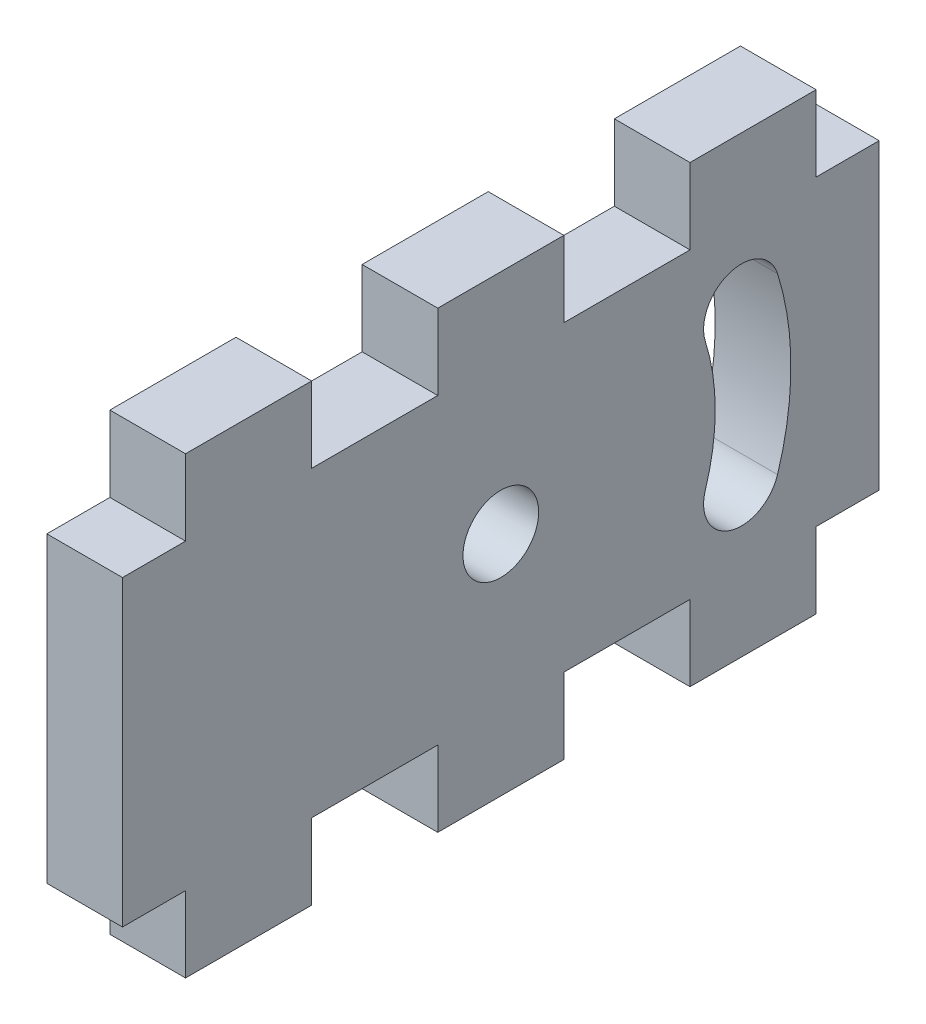
ISO-10303-21;
HEADER;
FILE_DESCRIPTION(('STEP AP214'),'2;1');
FILE_NAME('part.step','',(''),(''),'','','');
FILE_SCHEMA(('AUTOMOTIVE_DESIGN { 1 0 10303 214 1 1 1 1 }'));
ENDSEC;
DATA;
#1=APPLICATION_CONTEXT('core data for automotive mechanical design processes');
#2=APPLICATION_PROTOCOL_DEFINITION('international standard','automotive_design',2000,#1);
#3=PRODUCT_CONTEXT('',#1,'mechanical');
#4=PRODUCT('Part','Part','',(#3));
#5=PRODUCT_RELATED_PRODUCT_CATEGORY('part','',(#4));
#6=PRODUCT_DEFINITION_FORMATION('','',#4);
#7=PRODUCT_DEFINITION_CONTEXT('part definition',#1,'design');
#8=PRODUCT_DEFINITION('design','',#6,#7);
#9=PRODUCT_DEFINITION_SHAPE('','',#8);
#10=(LENGTH_UNIT() NAMED_UNIT(*) SI_UNIT(.MILLI.,.METRE.));
#11=(NAMED_UNIT(*) PLANE_ANGLE_UNIT() SI_UNIT($,.RADIAN.));
#12=(NAMED_UNIT(*) SI_UNIT($,.STERADIAN.) SOLID_ANGLE_UNIT());
#13=UNCERTAINTY_MEASURE_WITH_UNIT(LENGTH_MEASURE(1.E-05),#10,'distance_accuracy_value','');
#14=(GEOMETRIC_REPRESENTATION_CONTEXT(3) GLOBAL_UNCERTAINTY_ASSIGNED_CONTEXT((#13)) GLOBAL_UNIT_ASSIGNED_CONTEXT((#10,
#11,#12)) REPRESENTATION_CONTEXT('',''));
#15=CARTESIAN_POINT('',(0.,0.,0.));
#16=DIRECTION('',(0.,0.,1.));
#17=DIRECTION('',(1.,0.,0.));
#18=AXIS2_PLACEMENT_3D('',#15,#16,#17);
#19=CARTESIAN_POINT('',(3.,-6.,15.));
#20=DIRECTION('',(0.,1.,0.));
#21=DIRECTION('',(0.,0.,1.));
#22=AXIS2_PLACEMENT_3D('',#19,#20,#21);
#23=PLANE('',#22);
#24=DIRECTION('',(0.,0.,-1.));
#25=VECTOR('',#24,1.);
#26=CARTESIAN_POINT('',(3.,-6.,15.));
#27=LINE('',#26,#25);
#28=CARTESIAN_POINT('',(3.,-6.,7.50000000000001));
#29=VERTEX_POINT('',#28);
#30=CARTESIAN_POINT('',(3.,-6.,2.50000000000001));
#31=VERTEX_POINT('',#30);
#32=EDGE_CURVE('E453',#29,#31,#27,.T.);
#33=ORIENTED_EDGE('',*,*,#32,.F.);
#34=DIRECTION('',(1.,0.,0.));
#35=VECTOR('',#34,1.);
#36=CARTESIAN_POINT('',(0.,-6.,7.5));
#37=LINE('',#36,#35);
#38=CARTESIAN_POINT('',(0.,-6.,7.5));
#39=VERTEX_POINT('',#38);
#40=EDGE_CURVE('E293',#39,#29,#37,.T.);
#41=ORIENTED_EDGE('',*,*,#40,.F.);
#42=DIRECTION('',(0.,0.,-1.));
#43=VECTOR('',#42,1.);
#44=CARTESIAN_POINT('',(0.,-6.,15.));
#45=LINE('',#44,#43);
#46=CARTESIAN_POINT('',(0.,-6.,2.50000000000001));
#47=VERTEX_POINT('',#46);
#48=EDGE_CURVE('E464',#39,#47,#45,.T.);
#49=ORIENTED_EDGE('',*,*,#48,.T.);
#50=DIRECTION('',(1.,0.,0.));
#51=VECTOR('',#50,1.);
#52=CARTESIAN_POINT('',(0.,-6.,2.50000000000001));
#53=LINE('',#52,#51);
#54=EDGE_CURVE('E312',#47,#31,#53,.T.);
#55=ORIENTED_EDGE('',*,*,#54,.T.);
#56=EDGE_LOOP('',(#33,#41,#49,#55));
#57=FACE_BOUND('',#56,.T.);
#58=ADVANCED_FACE('F33',(#57),#23,.F.);
#59=CARTESIAN_POINT('',(3.,-6.,-2.49999999999999));
#60=VERTEX_POINT('',#59);
#61=CARTESIAN_POINT('',(3.,-6.,-7.49999999999999));
#62=VERTEX_POINT('',#61);
#63=EDGE_CURVE('E558',#60,#62,#27,.T.);
#64=ORIENTED_EDGE('',*,*,#63,.F.);
#65=DIRECTION('',(1.,0.,0.));
#66=VECTOR('',#65,1.);
#67=CARTESIAN_POINT('',(0.,-6.,-2.49999999999999));
#68=LINE('',#67,#66);
#69=CARTESIAN_POINT('',(0.,-6.,-2.49999999999999));
#70=VERTEX_POINT('',#69);
#71=EDGE_CURVE('E320',#70,#60,#68,.T.);
#72=ORIENTED_EDGE('',*,*,#71,.F.);
#73=CARTESIAN_POINT('',(0.,-6.,-7.49999999999999));
#74=VERTEX_POINT('',#73);
#75=EDGE_CURVE('E540',#70,#74,#45,.T.);
#76=ORIENTED_EDGE('',*,*,#75,.T.);
#77=DIRECTION('',(1.,0.,0.));
#78=VECTOR('',#77,1.);
#79=CARTESIAN_POINT('',(0.,-6.,-7.49999999999999));
#80=LINE('',#79,#78);
#81=EDGE_CURVE('E339',#74,#62,#80,.T.);
#82=ORIENTED_EDGE('',*,*,#81,.T.);
#83=EDGE_LOOP('',(#64,#72,#76,#82));
#84=FACE_BOUND('',#83,.T.);
#85=ADVANCED_FACE('F501',(#84),#23,.F.);
#86=DIRECTION('',(1.,0.,0.));
#87=VECTOR('',#86,1.);
#88=CARTESIAN_POINT('',(0.,-6.,-12.5));
#89=LINE('',#88,#87);
#90=CARTESIAN_POINT('',(0.,-6.,-12.5));
#91=VERTEX_POINT('',#90);
#92=CARTESIAN_POINT('',(3.,-6.,-12.5));
#93=VERTEX_POINT('',#92);
#94=EDGE_CURVE('E347',#91,#93,#89,.T.);
#95=ORIENTED_EDGE('',*,*,#94,.F.);
#96=CARTESIAN_POINT('',(0.,-6.,-15.));
#97=VERTEX_POINT('',#96);
#98=EDGE_CURVE('E462',#91,#97,#45,.T.);
#99=ORIENTED_EDGE('',*,*,#98,.T.);
#100=DIRECTION('',(-1.,0.,0.));
#101=VECTOR('',#100,1.);
#102=CARTESIAN_POINT('',(3.,-6.,-15.));
#103=LINE('',#102,#101);
#104=CARTESIAN_POINT('',(3.,-6.,-15.));
#105=VERTEX_POINT('',#104);
#106=EDGE_CURVE('E452',#105,#97,#103,.T.);
#107=ORIENTED_EDGE('',*,*,#106,.F.);
#108=EDGE_CURVE('E448',#93,#105,#27,.T.);
#109=ORIENTED_EDGE('',*,*,#108,.F.);
#110=EDGE_LOOP('',(#95,#99,#107,#109));
#111=FACE_BOUND('',#110,.T.);
#112=ADVANCED_FACE('F508',(#111),#23,.F.);
#113=CARTESIAN_POINT('',(3.,6.,15.));
#114=DIRECTION('',(0.,-1.,0.));
#115=DIRECTION('',(0.,0.,-1.));
#116=AXIS2_PLACEMENT_3D('',#113,#114,#115);
#117=PLANE('',#116);
#118=DIRECTION('',(0.,0.,1.));
#119=VECTOR('',#118,1.);
#120=CARTESIAN_POINT('',(3.,6.,15.));
#121=LINE('',#120,#119);
#122=CARTESIAN_POINT('',(3.,6.,-7.5));
#123=VERTEX_POINT('',#122);
#124=CARTESIAN_POINT('',(3.,6.,-2.5));
#125=VERTEX_POINT('',#124);
#126=EDGE_CURVE('E446',#123,#125,#121,.T.);
#127=ORIENTED_EDGE('',*,*,#126,.F.);
#128=DIRECTION('',(1.,0.,0.));
#129=VECTOR('',#128,1.);
#130=CARTESIAN_POINT('',(0.,6.,-7.5));
#131=LINE('',#130,#129);
#132=CARTESIAN_POINT('',(0.,6.,-7.5));
#133=VERTEX_POINT('',#132);
#134=EDGE_CURVE('E366',#133,#123,#131,.T.);
#135=ORIENTED_EDGE('',*,*,#134,.F.);
#136=DIRECTION('',(0.,0.,1.));
#137=VECTOR('',#136,1.);
#138=CARTESIAN_POINT('',(0.,6.,15.));
#139=LINE('',#138,#137);
#140=CARTESIAN_POINT('',(0.,6.,-2.5));
#141=VERTEX_POINT('',#140);
#142=EDGE_CURVE('E460',#133,#141,#139,.T.);
#143=ORIENTED_EDGE('',*,*,#142,.T.);
#144=DIRECTION('',(1.,0.,0.));
#145=VECTOR('',#144,1.);
#146=CARTESIAN_POINT('',(0.,6.,-2.5));
#147=LINE('',#146,#145);
#148=EDGE_CURVE('E406',#141,#125,#147,.T.);
#149=ORIENTED_EDGE('',*,*,#148,.T.);
#150=EDGE_LOOP('',(#127,#135,#143,#149));
#151=FACE_BOUND('',#150,.T.);
#152=ADVANCED_FACE('F523',(#151),#117,.F.);
#153=CARTESIAN_POINT('',(3.,6.,2.49999999999999));
#154=VERTEX_POINT('',#153);
#155=CARTESIAN_POINT('',(3.,6.,7.5));
#156=VERTEX_POINT('',#155);
#157=EDGE_CURVE('E580',#154,#156,#121,.T.);
#158=ORIENTED_EDGE('',*,*,#157,.F.);
#159=DIRECTION('',(1.,0.,0.));
#160=VECTOR('',#159,1.);
#161=CARTESIAN_POINT('',(0.,6.,2.49999999999999));
#162=LINE('',#161,#160);
#163=CARTESIAN_POINT('',(0.,6.,2.49999999999999));
#164=VERTEX_POINT('',#163);
#165=EDGE_CURVE('E393',#164,#154,#162,.T.);
#166=ORIENTED_EDGE('',*,*,#165,.F.);
#167=CARTESIAN_POINT('',(0.,6.,7.5));
#168=VERTEX_POINT('',#167);
#169=EDGE_CURVE('E606',#164,#168,#139,.T.);
#170=ORIENTED_EDGE('',*,*,#169,.T.);
#171=DIRECTION('',(1.,0.,0.));
#172=VECTOR('',#171,1.);
#173=CARTESIAN_POINT('',(0.,6.,7.5));
#174=LINE('',#173,#172);
#175=EDGE_CURVE('E433',#168,#156,#174,.T.);
#176=ORIENTED_EDGE('',*,*,#175,.T.);
#177=EDGE_LOOP('',(#158,#166,#170,#176));
#178=FACE_BOUND('',#177,.T.);
#179=ADVANCED_FACE('F528',(#178),#117,.F.);
#180=DIRECTION('',(1.,0.,0.));
#181=VECTOR('',#180,1.);
#182=CARTESIAN_POINT('',(0.,6.,12.5));
#183=LINE('',#182,#181);
#184=CARTESIAN_POINT('',(0.,6.,12.5));
#185=VERTEX_POINT('',#184);
#186=CARTESIAN_POINT('',(3.,6.,12.5));
#187=VERTEX_POINT('',#186);
#188=EDGE_CURVE('E420',#185,#187,#183,.T.);
#189=ORIENTED_EDGE('',*,*,#188,.F.);
#190=CARTESIAN_POINT('',(0.,6.,15.));
#191=VERTEX_POINT('',#190);
#192=EDGE_CURVE('E456',#185,#191,#139,.T.);
#193=ORIENTED_EDGE('',*,*,#192,.T.);
#194=DIRECTION('',(-1.,0.,0.));
#195=VECTOR('',#194,1.);
#196=CARTESIAN_POINT('',(3.,6.,15.));
#197=LINE('',#196,#195);
#198=CARTESIAN_POINT('',(3.,6.,15.));
#199=VERTEX_POINT('',#198);
#200=EDGE_CURVE('E470',#199,#191,#197,.T.);
#201=ORIENTED_EDGE('',*,*,#200,.F.);
#202=EDGE_CURVE('E440',#187,#199,#121,.T.);
#203=ORIENTED_EDGE('',*,*,#202,.F.);
#204=EDGE_LOOP('',(#189,#193,#201,#203));
#205=FACE_BOUND('',#204,.T.);
#206=ADVANCED_FACE('F589',(#205),#117,.F.);
#207=CARTESIAN_POINT('',(3.,6.,-15.));
#208=DIRECTION('',(0.,0.,1.));
#209=DIRECTION('',(0.,-1.,0.));
#210=AXIS2_PLACEMENT_3D('',#207,#208,#209);
#211=PLANE('',#210);
#212=DIRECTION('',(0.,1.,0.));
#213=VECTOR('',#212,1.);
#214=CARTESIAN_POINT('',(0.,6.,-15.));
#215=LINE('',#214,#213);
#216=CARTESIAN_POINT('',(0.,6.,-15.));
#217=VERTEX_POINT('',#216);
#218=EDGE_CURVE('E430',#97,#217,#215,.T.);
#219=ORIENTED_EDGE('',*,*,#218,.T.);
#220=DIRECTION('',(-1.,0.,0.));
#221=VECTOR('',#220,1.);
#222=CARTESIAN_POINT('',(3.,6.,-15.));
#223=LINE('',#222,#221);
#224=CARTESIAN_POINT('',(3.,6.,-15.));
#225=VERTEX_POINT('',#224);
#226=EDGE_CURVE('E473',#225,#217,#223,.T.);
#227=ORIENTED_EDGE('',*,*,#226,.F.);
#228=DIRECTION('',(0.,1.,0.));
#229=VECTOR('',#228,1.);
#230=CARTESIAN_POINT('',(3.,6.,-15.));
#231=LINE('',#230,#229);
#232=EDGE_CURVE('E437',#105,#225,#231,.T.);
#233=ORIENTED_EDGE('',*,*,#232,.F.);
#234=ORIENTED_EDGE('',*,*,#106,.T.);
#235=EDGE_LOOP('',(#219,#227,#233,#234));
#236=FACE_BOUND('',#235,.T.);
#237=ADVANCED_FACE('F35',(#236),#211,.F.);
#238=CARTESIAN_POINT('',(0.,6.,-12.5));
#239=VERTEX_POINT('',#238);
#240=EDGE_CURVE('E457',#217,#239,#139,.T.);
#241=ORIENTED_EDGE('',*,*,#240,.T.);
#242=DIRECTION('',(1.,0.,0.));
#243=VECTOR('',#242,1.);
#244=CARTESIAN_POINT('',(0.,6.,-12.5));
#245=LINE('',#244,#243);
#246=CARTESIAN_POINT('',(3.,6.,-12.5));
#247=VERTEX_POINT('',#246);
#248=EDGE_CURVE('E379',#239,#247,#245,.T.);
#249=ORIENTED_EDGE('',*,*,#248,.T.);
#250=EDGE_CURVE('E442',#225,#247,#121,.T.);
#251=ORIENTED_EDGE('',*,*,#250,.F.);
#252=ORIENTED_EDGE('',*,*,#226,.T.);
#253=EDGE_LOOP('',(#241,#249,#251,#252));
#254=FACE_BOUND('',#253,.T.);
#255=ADVANCED_FACE('F520',(#254),#117,.F.);
#256=CARTESIAN_POINT('',(3.,6.,15.));
#257=DIRECTION('',(0.,0.,-1.));
#258=DIRECTION('',(0.,1.,0.));
#259=AXIS2_PLACEMENT_3D('',#256,#257,#258);
#260=PLANE('',#259);
#261=DIRECTION('',(0.,-1.,0.));
#262=VECTOR('',#261,1.);
#263=CARTESIAN_POINT('',(0.,6.,15.));
#264=LINE('',#263,#262);
#265=CARTESIAN_POINT('',(0.,-6.,15.));
#266=VERTEX_POINT('',#265);
#267=EDGE_CURVE('E459',#191,#266,#264,.T.);
#268=ORIENTED_EDGE('',*,*,#267,.T.);
#269=DIRECTION('',(-1.,0.,0.));
#270=VECTOR('',#269,1.);
#271=CARTESIAN_POINT('',(3.,-6.,15.));
#272=LINE('',#271,#270);
#273=CARTESIAN_POINT('',(3.,-6.,15.));
#274=VERTEX_POINT('',#273);
#275=EDGE_CURVE('E467',#274,#266,#272,.T.);
#276=ORIENTED_EDGE('',*,*,#275,.F.);
#277=DIRECTION('',(0.,-1.,0.));
#278=VECTOR('',#277,1.);
#279=CARTESIAN_POINT('',(3.,6.,15.));
#280=LINE('',#279,#278);
#281=EDGE_CURVE('E445',#199,#274,#280,.T.);
#282=ORIENTED_EDGE('',*,*,#281,.F.);
#283=ORIENTED_EDGE('',*,*,#200,.T.);
#284=EDGE_LOOP('',(#268,#276,#282,#283));
#285=FACE_BOUND('',#284,.T.);
#286=ADVANCED_FACE('F513',(#285),#260,.F.);
#287=CARTESIAN_POINT('',(0.,-6.,12.5));
#288=VERTEX_POINT('',#287);
#289=EDGE_CURVE('E441',#266,#288,#45,.T.);
#290=ORIENTED_EDGE('',*,*,#289,.T.);
#291=DIRECTION('',(1.,0.,0.));
#292=VECTOR('',#291,1.);
#293=CARTESIAN_POINT('',(0.,-6.,12.5));
#294=LINE('',#293,#292);
#295=CARTESIAN_POINT('',(3.,-6.,12.5));
#296=VERTEX_POINT('',#295);
#297=EDGE_CURVE('E284',#288,#296,#294,.T.);
#298=ORIENTED_EDGE('',*,*,#297,.T.);
#299=EDGE_CURVE('E449',#274,#296,#27,.T.);
#300=ORIENTED_EDGE('',*,*,#299,.F.);
#301=ORIENTED_EDGE('',*,*,#275,.T.);
#302=EDGE_LOOP('',(#290,#298,#300,#301));
#303=FACE_BOUND('',#302,.T.);
#304=ADVANCED_FACE('F504',(#303),#23,.F.);
#305=CARTESIAN_POINT('',(3.,0.,0.));
#306=DIRECTION('',(1.,0.,0.));
#307=DIRECTION('',(0.,0.,-1.));
#308=AXIS2_PLACEMENT_3D('',#305,#306,#307);
#309=PLANE('',#308);
#310=CARTESIAN_POINT('',(3.,-3.,-9.53939201416946));
#311=DIRECTION('',(1.,0.,0.));
#312=DIRECTION('',(0.,0.,-1.));
#313=AXIS2_PLACEMENT_3D('',#310,#311,#312);
#314=CIRCLE('',#313,1.5);
#315=CARTESIAN_POINT('',(3.,-2.55,-8.10848321204404));
#316=VERTEX_POINT('',#315);
#317=CARTESIAN_POINT('',(3.,-3.45,-10.9703008162949));
#318=VERTEX_POINT('',#317);
#319=EDGE_CURVE('E48',#316,#318,#314,.T.);
#320=ORIENTED_EDGE('',*,*,#319,.F.);
#321=CARTESIAN_POINT('',(3.,0.,0.));
#322=DIRECTION('',(-1.,0.,0.));
#323=DIRECTION('',(0.,0.,-1.));
#324=AXIS2_PLACEMENT_3D('',#321,#322,#323);
#325=CIRCLE('',#324,8.5);
#326=CARTESIAN_POINT('',(3.,2.55,-8.10848321204404));
#327=VERTEX_POINT('',#326);
#328=EDGE_CURVE('E261',#327,#316,#325,.T.);
#329=ORIENTED_EDGE('',*,*,#328,.F.);
#330=CARTESIAN_POINT('',(3.,3.,-9.53939201416946));
#331=DIRECTION('',(1.,0.,0.));
#332=DIRECTION('',(0.,0.,-1.));
#333=AXIS2_PLACEMENT_3D('',#330,#331,#332);
#334=CIRCLE('',#333,1.5);
#335=CARTESIAN_POINT('',(3.,3.45,-10.9703008162949));
#336=VERTEX_POINT('',#335);
#337=EDGE_CURVE('E245',#336,#327,#334,.T.);
#338=ORIENTED_EDGE('',*,*,#337,.F.);
#339=CARTESIAN_POINT('',(3.,0.,0.));
#340=DIRECTION('',(1.,0.,0.));
#341=DIRECTION('',(0.,0.,-1.));
#342=AXIS2_PLACEMENT_3D('',#339,#340,#341);
#343=CIRCLE('',#342,11.5);
#344=EDGE_CURVE('E254',#318,#336,#343,.T.);
#345=ORIENTED_EDGE('',*,*,#344,.F.);
#346=EDGE_LOOP('',(#320,#329,#338,#345));
#347=FACE_BOUND('',#346,.T.);
#348=CARTESIAN_POINT('',(3.,0.,0.));
#349=DIRECTION('',(1.,0.,0.));
#350=DIRECTION('',(0.,0.,-1.));
#351=AXIS2_PLACEMENT_3D('',#348,#349,#350);
#352=CIRCLE('',#351,1.5);
#353=CARTESIAN_POINT('',(3.,0.,-1.5));
#354=VERTEX_POINT('',#353);
#355=EDGE_CURVE('E268',#354,#354,#352,.T.);
#356=ORIENTED_EDGE('',*,*,#355,.F.);
#357=EDGE_LOOP('',(#356));
#358=FACE_BOUND('',#357,.T.);
#359=ORIENTED_EDGE('',*,*,#232,.T.);
#360=ORIENTED_EDGE('',*,*,#250,.T.);
#361=DIRECTION('',(0.,1.,0.));
#362=VECTOR('',#361,1.);
#363=CARTESIAN_POINT('',(3.,6.,-12.5));
#364=LINE('',#363,#362);
#365=CARTESIAN_POINT('',(3.,9.,-12.5));
#366=VERTEX_POINT('',#365);
#367=EDGE_CURVE('E369',#247,#366,#364,.T.);
#368=ORIENTED_EDGE('',*,*,#367,.T.);
#369=DIRECTION('',(0.,0.,1.));
#370=VECTOR('',#369,1.);
#371=CARTESIAN_POINT('',(3.,9.,-7.5));
#372=LINE('',#371,#370);
#373=CARTESIAN_POINT('',(3.,9.,-7.5));
#374=VERTEX_POINT('',#373);
#375=EDGE_CURVE('E360',#366,#374,#372,.T.);
#376=ORIENTED_EDGE('',*,*,#375,.T.);
#377=DIRECTION('',(0.,-1.,0.));
#378=VECTOR('',#377,1.);
#379=CARTESIAN_POINT('',(3.,6.,-7.5));
#380=LINE('',#379,#378);
#381=EDGE_CURVE('E349',#374,#123,#380,.T.);
#382=ORIENTED_EDGE('',*,*,#381,.T.);
#383=ORIENTED_EDGE('',*,*,#126,.T.);
#384=DIRECTION('',(0.,1.,0.));
#385=VECTOR('',#384,1.);
#386=CARTESIAN_POINT('',(3.,6.,-2.5));
#387=LINE('',#386,#385);
#388=CARTESIAN_POINT('',(3.,9.,-2.50000000000001));
#389=VERTEX_POINT('',#388);
#390=EDGE_CURVE('E396',#125,#389,#387,.T.);
#391=ORIENTED_EDGE('',*,*,#390,.T.);
#392=DIRECTION('',(0.,0.,1.));
#393=VECTOR('',#392,1.);
#394=CARTESIAN_POINT('',(3.,9.,2.49999999999999));
#395=LINE('',#394,#393);
#396=CARTESIAN_POINT('',(3.,9.,2.49999999999999));
#397=VERTEX_POINT('',#396);
#398=EDGE_CURVE('E387',#389,#397,#395,.T.);
#399=ORIENTED_EDGE('',*,*,#398,.T.);
#400=DIRECTION('',(0.,-1.,0.));
#401=VECTOR('',#400,1.);
#402=CARTESIAN_POINT('',(3.,6.,2.49999999999999));
#403=LINE('',#402,#401);
#404=EDGE_CURVE('E376',#397,#154,#403,.T.);
#405=ORIENTED_EDGE('',*,*,#404,.T.);
#406=ORIENTED_EDGE('',*,*,#157,.T.);
#407=DIRECTION('',(0.,1.,0.));
#408=VECTOR('',#407,1.);
#409=CARTESIAN_POINT('',(3.,6.,7.5));
#410=LINE('',#409,#408);
#411=CARTESIAN_POINT('',(3.,9.,7.5));
#412=VERTEX_POINT('',#411);
#413=EDGE_CURVE('E423',#156,#412,#410,.T.);
#414=ORIENTED_EDGE('',*,*,#413,.T.);
#415=DIRECTION('',(0.,0.,1.));
#416=VECTOR('',#415,1.);
#417=CARTESIAN_POINT('',(3.,9.,12.5));
#418=LINE('',#417,#416);
#419=CARTESIAN_POINT('',(3.,9.,12.5));
#420=VERTEX_POINT('',#419);
#421=EDGE_CURVE('E414',#412,#420,#418,.T.);
#422=ORIENTED_EDGE('',*,*,#421,.T.);
#423=DIRECTION('',(0.,-1.,0.));
#424=VECTOR('',#423,1.);
#425=CARTESIAN_POINT('',(3.,6.,12.5));
#426=LINE('',#425,#424);
#427=EDGE_CURVE('E403',#420,#187,#426,.T.);
#428=ORIENTED_EDGE('',*,*,#427,.T.);
#429=ORIENTED_EDGE('',*,*,#202,.T.);
#430=ORIENTED_EDGE('',*,*,#281,.T.);
#431=ORIENTED_EDGE('',*,*,#299,.T.);
#432=DIRECTION('',(0.,-1.,0.));
#433=VECTOR('',#432,1.);
#434=CARTESIAN_POINT('',(3.,-6.,12.5));
#435=LINE('',#434,#433);
#436=CARTESIAN_POINT('',(3.,-9.,12.5));
#437=VERTEX_POINT('',#436);
#438=EDGE_CURVE('E285',#296,#437,#435,.T.);
#439=ORIENTED_EDGE('',*,*,#438,.T.);
#440=DIRECTION('',(0.,0.,-1.));
#441=VECTOR('',#440,1.);
#442=CARTESIAN_POINT('',(3.,-9.,12.5));
#443=LINE('',#442,#441);
#444=CARTESIAN_POINT('',(3.,-9.,7.50000000000001));
#445=VERTEX_POINT('',#444);
#446=EDGE_CURVE('E288',#437,#445,#443,.T.);
#447=ORIENTED_EDGE('',*,*,#446,.T.);
#448=DIRECTION('',(0.,1.,0.));
#449=VECTOR('',#448,1.);
#450=CARTESIAN_POINT('',(3.,-6.,7.5));
#451=LINE('',#450,#449);
#452=EDGE_CURVE('E278',#445,#29,#451,.T.);
#453=ORIENTED_EDGE('',*,*,#452,.T.);
#454=ORIENTED_EDGE('',*,*,#32,.T.);
#455=DIRECTION('',(0.,-1.,0.));
#456=VECTOR('',#455,1.);
#457=CARTESIAN_POINT('',(3.,-6.,2.50000000000001));
#458=LINE('',#457,#456);
#459=CARTESIAN_POINT('',(3.,-9.,2.50000000000001));
#460=VERTEX_POINT('',#459);
#461=EDGE_CURVE('E296',#31,#460,#458,.T.);
#462=ORIENTED_EDGE('',*,*,#461,.T.);
#463=DIRECTION('',(0.,0.,-1.));
#464=VECTOR('',#463,1.);
#465=CARTESIAN_POINT('',(3.,-9.,2.50000000000001));
#466=LINE('',#465,#464);
#467=CARTESIAN_POINT('',(3.,-9.,-2.49999999999999));
#468=VERTEX_POINT('',#467);
#469=EDGE_CURVE('E315',#460,#468,#466,.T.);
#470=ORIENTED_EDGE('',*,*,#469,.T.);
#471=DIRECTION('',(0.,1.,0.));
#472=VECTOR('',#471,1.);
#473=CARTESIAN_POINT('',(3.,-6.,-2.49999999999999));
#474=LINE('',#473,#472);
#475=EDGE_CURVE('E306',#468,#60,#474,.T.);
#476=ORIENTED_EDGE('',*,*,#475,.T.);
#477=ORIENTED_EDGE('',*,*,#63,.T.);
#478=DIRECTION('',(0.,-1.,0.));
#479=VECTOR('',#478,1.);
#480=CARTESIAN_POINT('',(3.,-6.,-7.49999999999999));
#481=LINE('',#480,#479);
#482=CARTESIAN_POINT('',(3.,-9.,-7.49999999999999));
#483=VERTEX_POINT('',#482);
#484=EDGE_CURVE('E323',#62,#483,#481,.T.);
#485=ORIENTED_EDGE('',*,*,#484,.T.);
#486=DIRECTION('',(0.,0.,-1.));
#487=VECTOR('',#486,1.);
#488=CARTESIAN_POINT('',(3.,-9.,-7.49999999999999));
#489=LINE('',#488,#487);
#490=CARTESIAN_POINT('',(3.,-9.,-12.5));
#491=VERTEX_POINT('',#490);
#492=EDGE_CURVE('E342',#483,#491,#489,.T.);
#493=ORIENTED_EDGE('',*,*,#492,.T.);
#494=DIRECTION('',(0.,1.,0.));
#495=VECTOR('',#494,1.);
#496=CARTESIAN_POINT('',(3.,-6.,-12.5));
#497=LINE('',#496,#495);
#498=EDGE_CURVE('E334',#491,#93,#497,.T.);
#499=ORIENTED_EDGE('',*,*,#498,.T.);
#500=ORIENTED_EDGE('',*,*,#108,.T.);
#501=EDGE_LOOP('',(#359,#360,#368,#376,#382,#383,#391,#399,#405,#406,#414,#422,#428,#429,#430,
#431,#439,#447,#453,#454,#462,#470,#476,#477,#485,#493,#499,#500));
#502=FACE_BOUND('',#501,.T.);
#503=ADVANCED_FACE('F258',(#347,#358,#502),#309,.T.);
#504=CARTESIAN_POINT('',(0.,0.,0.));
#505=DIRECTION('',(1.,0.,0.));
#506=DIRECTION('',(0.,0.,-1.));
#507=AXIS2_PLACEMENT_3D('',#504,#505,#506);
#508=PLANE('',#507);
#509=CARTESIAN_POINT('',(0.,0.,0.));
#510=DIRECTION('',(1.,0.,0.));
#511=DIRECTION('',(0.,0.,-1.));
#512=AXIS2_PLACEMENT_3D('',#509,#510,#511);
#513=CIRCLE('',#512,8.5);
#514=CARTESIAN_POINT('',(0.,2.55,-8.10848321204404));
#515=VERTEX_POINT('',#514);
#516=CARTESIAN_POINT('',(0.,-2.55,-8.10848321204404));
#517=VERTEX_POINT('',#516);
#518=EDGE_CURVE('E41',#515,#517,#513,.F.);
#519=ORIENTED_EDGE('',*,*,#518,.T.);
#520=CARTESIAN_POINT('',(0.,-3.,-9.53939201416946));
#521=DIRECTION('',(1.,0.,0.));
#522=DIRECTION('',(0.,0.,-1.));
#523=AXIS2_PLACEMENT_3D('',#520,#521,#522);
#524=CIRCLE('',#523,1.5);
#525=CARTESIAN_POINT('',(0.,-3.45,-10.9703008162949));
#526=VERTEX_POINT('',#525);
#527=EDGE_CURVE('E11',#517,#526,#524,.T.);
#528=ORIENTED_EDGE('',*,*,#527,.T.);
#529=CARTESIAN_POINT('',(0.,0.,0.));
#530=DIRECTION('',(1.,0.,0.));
#531=DIRECTION('',(0.,0.,-1.));
#532=AXIS2_PLACEMENT_3D('',#529,#530,#531);
#533=CIRCLE('',#532,11.5);
#534=CARTESIAN_POINT('',(0.,3.45,-10.9703008162949));
#535=VERTEX_POINT('',#534);
#536=EDGE_CURVE('E476',#526,#535,#533,.T.);
#537=ORIENTED_EDGE('',*,*,#536,.T.);
#538=CARTESIAN_POINT('',(0.,3.,-9.53939201416946));
#539=DIRECTION('',(1.,0.,0.));
#540=DIRECTION('',(0.,0.,-1.));
#541=AXIS2_PLACEMENT_3D('',#538,#539,#540);
#542=CIRCLE('',#541,1.5);
#543=EDGE_CURVE('E248',#535,#515,#542,.T.);
#544=ORIENTED_EDGE('',*,*,#543,.T.);
#545=EDGE_LOOP('',(#519,#528,#537,#544));
#546=FACE_BOUND('',#545,.T.);
#547=CARTESIAN_POINT('',(0.,0.,0.));
#548=DIRECTION('',(1.,0.,0.));
#549=DIRECTION('',(0.,0.,-1.));
#550=AXIS2_PLACEMENT_3D('',#547,#548,#549);
#551=CIRCLE('',#550,1.5);
#552=CARTESIAN_POINT('',(0.,0.,-1.5));
#553=VERTEX_POINT('',#552);
#554=EDGE_CURVE('E273',#553,#553,#551,.T.);
#555=ORIENTED_EDGE('',*,*,#554,.T.);
#556=EDGE_LOOP('',(#555));
#557=FACE_BOUND('',#556,.T.);
#558=ORIENTED_EDGE('',*,*,#218,.F.);
#559=ORIENTED_EDGE('',*,*,#98,.F.);
#560=DIRECTION('',(0.,1.,0.));
#561=VECTOR('',#560,1.);
#562=CARTESIAN_POINT('',(0.,-6.,-12.5));
#563=LINE('',#562,#561);
#564=CARTESIAN_POINT('',(0.,-9.,-12.5));
#565=VERTEX_POINT('',#564);
#566=EDGE_CURVE('E337',#565,#91,#563,.T.);
#567=ORIENTED_EDGE('',*,*,#566,.F.);
#568=DIRECTION('',(0.,0.,-1.));
#569=VECTOR('',#568,1.);
#570=CARTESIAN_POINT('',(0.,-9.,-7.49999999999999));
#571=LINE('',#570,#569);
#572=CARTESIAN_POINT('',(0.,-9.,-7.49999999999999));
#573=VERTEX_POINT('',#572);
#574=EDGE_CURVE('E333',#573,#565,#571,.T.);
#575=ORIENTED_EDGE('',*,*,#574,.F.);
#576=DIRECTION('',(0.,-1.,0.));
#577=VECTOR('',#576,1.);
#578=CARTESIAN_POINT('',(0.,-6.,-7.49999999999999));
#579=LINE('',#578,#577);
#580=EDGE_CURVE('E330',#74,#573,#579,.T.);
#581=ORIENTED_EDGE('',*,*,#580,.F.);
#582=ORIENTED_EDGE('',*,*,#75,.F.);
#583=DIRECTION('',(0.,1.,0.));
#584=VECTOR('',#583,1.);
#585=CARTESIAN_POINT('',(0.,-6.,-2.49999999999999));
#586=LINE('',#585,#584);
#587=CARTESIAN_POINT('',(0.,-9.,-2.49999999999999));
#588=VERTEX_POINT('',#587);
#589=EDGE_CURVE('E309',#588,#70,#586,.T.);
#590=ORIENTED_EDGE('',*,*,#589,.F.);
#591=DIRECTION('',(0.,0.,-1.));
#592=VECTOR('',#591,1.);
#593=CARTESIAN_POINT('',(0.,-9.,2.50000000000001));
#594=LINE('',#593,#592);
#595=CARTESIAN_POINT('',(0.,-9.,2.50000000000001));
#596=VERTEX_POINT('',#595);
#597=EDGE_CURVE('E305',#596,#588,#594,.T.);
#598=ORIENTED_EDGE('',*,*,#597,.F.);
#599=DIRECTION('',(0.,-1.,0.));
#600=VECTOR('',#599,1.);
#601=CARTESIAN_POINT('',(0.,-6.,2.50000000000001));
#602=LINE('',#601,#600);
#603=EDGE_CURVE('E302',#47,#596,#602,.T.);
#604=ORIENTED_EDGE('',*,*,#603,.F.);
#605=ORIENTED_EDGE('',*,*,#48,.F.);
#606=DIRECTION('',(0.,1.,0.));
#607=VECTOR('',#606,1.);
#608=CARTESIAN_POINT('',(0.,-6.,7.5));
#609=LINE('',#608,#607);
#610=CARTESIAN_POINT('',(0.,-9.,7.50000000000001));
#611=VERTEX_POINT('',#610);
#612=EDGE_CURVE('E281',#611,#39,#609,.T.);
#613=ORIENTED_EDGE('',*,*,#612,.F.);
#614=DIRECTION('',(0.,0.,-1.));
#615=VECTOR('',#614,1.);
#616=CARTESIAN_POINT('',(0.,-9.,12.5));
#617=LINE('',#616,#615);
#618=CARTESIAN_POINT('',(0.,-9.,12.5));
#619=VERTEX_POINT('',#618);
#620=EDGE_CURVE('E277',#619,#611,#617,.T.);
#621=ORIENTED_EDGE('',*,*,#620,.F.);
#622=DIRECTION('',(0.,-1.,0.));
#623=VECTOR('',#622,1.);
#624=CARTESIAN_POINT('',(0.,-6.,12.5));
#625=LINE('',#624,#623);
#626=EDGE_CURVE('E274',#288,#619,#625,.T.);
#627=ORIENTED_EDGE('',*,*,#626,.F.);
#628=ORIENTED_EDGE('',*,*,#289,.F.);
#629=ORIENTED_EDGE('',*,*,#267,.F.);
#630=ORIENTED_EDGE('',*,*,#192,.F.);
#631=DIRECTION('',(0.,-1.,0.));
#632=VECTOR('',#631,1.);
#633=CARTESIAN_POINT('',(0.,6.,12.5));
#634=LINE('',#633,#632);
#635=CARTESIAN_POINT('',(0.,9.,12.5));
#636=VERTEX_POINT('',#635);
#637=EDGE_CURVE('E411',#636,#185,#634,.T.);
#638=ORIENTED_EDGE('',*,*,#637,.F.);
#639=DIRECTION('',(0.,0.,1.));
#640=VECTOR('',#639,1.);
#641=CARTESIAN_POINT('',(0.,9.,12.5));
#642=LINE('',#641,#640);
#643=CARTESIAN_POINT('',(0.,9.,7.5));
#644=VERTEX_POINT('',#643);
#645=EDGE_CURVE('E417',#644,#636,#642,.T.);
#646=ORIENTED_EDGE('',*,*,#645,.F.);
#647=DIRECTION('',(0.,1.,0.));
#648=VECTOR('',#647,1.);
#649=CARTESIAN_POINT('',(0.,6.,7.5));
#650=LINE('',#649,#648);
#651=EDGE_CURVE('E413',#168,#644,#650,.T.);
#652=ORIENTED_EDGE('',*,*,#651,.F.);
#653=ORIENTED_EDGE('',*,*,#169,.F.);
#654=DIRECTION('',(0.,-1.,0.));
#655=VECTOR('',#654,1.);
#656=CARTESIAN_POINT('',(0.,6.,2.49999999999999));
#657=LINE('',#656,#655);
#658=CARTESIAN_POINT('',(0.,9.,2.49999999999999));
#659=VERTEX_POINT('',#658);
#660=EDGE_CURVE('E383',#659,#164,#657,.T.);
#661=ORIENTED_EDGE('',*,*,#660,.F.);
#662=DIRECTION('',(0.,0.,1.));
#663=VECTOR('',#662,1.);
#664=CARTESIAN_POINT('',(0.,9.,2.49999999999999));
#665=LINE('',#664,#663);
#666=CARTESIAN_POINT('',(0.,9.,-2.50000000000001));
#667=VERTEX_POINT('',#666);
#668=EDGE_CURVE('E390',#667,#659,#665,.T.);
#669=ORIENTED_EDGE('',*,*,#668,.F.);
#670=DIRECTION('',(0.,1.,0.));
#671=VECTOR('',#670,1.);
#672=CARTESIAN_POINT('',(0.,6.,-2.5));
#673=LINE('',#672,#671);
#674=EDGE_CURVE('E386',#141,#667,#673,.T.);
#675=ORIENTED_EDGE('',*,*,#674,.F.);
#676=ORIENTED_EDGE('',*,*,#142,.F.);
#677=DIRECTION('',(0.,-1.,0.));
#678=VECTOR('',#677,1.);
#679=CARTESIAN_POINT('',(0.,6.,-7.5));
#680=LINE('',#679,#678);
#681=CARTESIAN_POINT('',(0.,9.,-7.5));
#682=VERTEX_POINT('',#681);
#683=EDGE_CURVE('E356',#682,#133,#680,.T.);
#684=ORIENTED_EDGE('',*,*,#683,.F.);
#685=DIRECTION('',(0.,0.,1.));
#686=VECTOR('',#685,1.);
#687=CARTESIAN_POINT('',(0.,9.,-7.5));
#688=LINE('',#687,#686);
#689=CARTESIAN_POINT('',(0.,9.,-12.5));
#690=VERTEX_POINT('',#689);
#691=EDGE_CURVE('E363',#690,#682,#688,.T.);
#692=ORIENTED_EDGE('',*,*,#691,.F.);
#693=DIRECTION('',(0.,1.,0.));
#694=VECTOR('',#693,1.);
#695=CARTESIAN_POINT('',(0.,6.,-12.5));
#696=LINE('',#695,#694);
#697=EDGE_CURVE('E359',#239,#690,#696,.T.);
#698=ORIENTED_EDGE('',*,*,#697,.F.);
#699=ORIENTED_EDGE('',*,*,#240,.F.);
#700=EDGE_LOOP('',(#558,#559,#567,#575,#581,#582,#590,#598,#604,#605,#613,#621,#627,#628,#629,
#630,#638,#646,#652,#653,#661,#669,#675,#676,#684,#692,#698,#699));
#701=FACE_BOUND('',#700,.T.);
#702=ADVANCED_FACE('F482',(#546,#557,#701),#508,.F.);
#703=CARTESIAN_POINT('',(0.,6.,12.5));
#704=DIRECTION('',(0.,0.,1.));
#705=DIRECTION('',(1.,0.,0.));
#706=AXIS2_PLACEMENT_3D('',#703,#704,#705);
#707=PLANE('',#706);
#708=ORIENTED_EDGE('',*,*,#427,.F.);
#709=DIRECTION('',(1.,0.,0.));
#710=VECTOR('',#709,1.);
#711=CARTESIAN_POINT('',(0.,9.,12.5));
#712=LINE('',#711,#710);
#713=EDGE_CURVE('E428',#636,#420,#712,.T.);
#714=ORIENTED_EDGE('',*,*,#713,.F.);
#715=ORIENTED_EDGE('',*,*,#637,.T.);
#716=ORIENTED_EDGE('',*,*,#188,.T.);
#717=EDGE_LOOP('',(#708,#714,#715,#716));
#718=FACE_BOUND('',#717,.T.);
#719=ADVANCED_FACE('F618',(#718),#707,.T.);
#720=CARTESIAN_POINT('',(0.,9.,12.5));
#721=DIRECTION('',(0.,1.,0.));
#722=DIRECTION('',(0.,0.,1.));
#723=AXIS2_PLACEMENT_3D('',#720,#721,#722);
#724=PLANE('',#723);
#725=ORIENTED_EDGE('',*,*,#421,.F.);
#726=DIRECTION('',(1.,0.,0.));
#727=VECTOR('',#726,1.);
#728=CARTESIAN_POINT('',(0.,9.,7.5));
#729=LINE('',#728,#727);
#730=EDGE_CURVE('E431',#644,#412,#729,.T.);
#731=ORIENTED_EDGE('',*,*,#730,.F.);
#732=ORIENTED_EDGE('',*,*,#645,.T.);
#733=ORIENTED_EDGE('',*,*,#713,.T.);
#734=EDGE_LOOP('',(#725,#731,#732,#733));
#735=FACE_BOUND('',#734,.T.);
#736=ADVANCED_FACE('F616',(#735),#724,.T.);
#737=CARTESIAN_POINT('',(0.,6.,7.5));
#738=DIRECTION('',(0.,0.,-1.));
#739=DIRECTION('',(0.,1.,0.));
#740=AXIS2_PLACEMENT_3D('',#737,#738,#739);
#741=PLANE('',#740);
#742=ORIENTED_EDGE('',*,*,#413,.F.);
#743=ORIENTED_EDGE('',*,*,#175,.F.);
#744=ORIENTED_EDGE('',*,*,#651,.T.);
#745=ORIENTED_EDGE('',*,*,#730,.T.);
#746=EDGE_LOOP('',(#742,#743,#744,#745));
#747=FACE_BOUND('',#746,.T.);
#748=ADVANCED_FACE('F613',(#747),#741,.T.);
#749=CARTESIAN_POINT('',(0.,6.,2.49999999999999));
#750=DIRECTION('',(0.,0.,1.));
#751=DIRECTION('',(0.,-1.,0.));
#752=AXIS2_PLACEMENT_3D('',#749,#750,#751);
#753=PLANE('',#752);
#754=ORIENTED_EDGE('',*,*,#404,.F.);
#755=DIRECTION('',(1.,0.,0.));
#756=VECTOR('',#755,1.);
#757=CARTESIAN_POINT('',(0.,9.,2.49999999999999));
#758=LINE('',#757,#756);
#759=EDGE_CURVE('E401',#659,#397,#758,.T.);
#760=ORIENTED_EDGE('',*,*,#759,.F.);
#761=ORIENTED_EDGE('',*,*,#660,.T.);
#762=ORIENTED_EDGE('',*,*,#165,.T.);
#763=EDGE_LOOP('',(#754,#760,#761,#762));
#764=FACE_BOUND('',#763,.T.);
#765=ADVANCED_FACE('F628',(#764),#753,.T.);
#766=CARTESIAN_POINT('',(0.,9.,2.49999999999999));
#767=DIRECTION('',(0.,1.,0.));
#768=DIRECTION('',(0.,0.,1.));
#769=AXIS2_PLACEMENT_3D('',#766,#767,#768);
#770=PLANE('',#769);
#771=ORIENTED_EDGE('',*,*,#398,.F.);
#772=DIRECTION('',(1.,0.,0.));
#773=VECTOR('',#772,1.);
#774=CARTESIAN_POINT('',(0.,9.,-2.50000000000001));
#775=LINE('',#774,#773);
#776=EDGE_CURVE('E404',#667,#389,#775,.T.);
#777=ORIENTED_EDGE('',*,*,#776,.F.);
#778=ORIENTED_EDGE('',*,*,#668,.T.);
#779=ORIENTED_EDGE('',*,*,#759,.T.);
#780=EDGE_LOOP('',(#771,#777,#778,#779));
#781=FACE_BOUND('',#780,.T.);
#782=ADVANCED_FACE('F632',(#781),#770,.T.);
#783=CARTESIAN_POINT('',(0.,6.,-2.5));
#784=DIRECTION('',(0.,0.,-1.));
#785=DIRECTION('',(0.,1.,0.));
#786=AXIS2_PLACEMENT_3D('',#783,#784,#785);
#787=PLANE('',#786);
#788=ORIENTED_EDGE('',*,*,#390,.F.);
#789=ORIENTED_EDGE('',*,*,#148,.F.);
#790=ORIENTED_EDGE('',*,*,#674,.T.);
#791=ORIENTED_EDGE('',*,*,#776,.T.);
#792=EDGE_LOOP('',(#788,#789,#790,#791));
#793=FACE_BOUND('',#792,.T.);
#794=ADVANCED_FACE('F634',(#793),#787,.T.);
#795=CARTESIAN_POINT('',(0.,6.,-7.5));
#796=DIRECTION('',(0.,0.,1.));
#797=DIRECTION('',(0.,-1.,0.));
#798=AXIS2_PLACEMENT_3D('',#795,#796,#797);
#799=PLANE('',#798);
#800=ORIENTED_EDGE('',*,*,#381,.F.);
#801=DIRECTION('',(1.,0.,0.));
#802=VECTOR('',#801,1.);
#803=CARTESIAN_POINT('',(0.,9.,-7.5));
#804=LINE('',#803,#802);
#805=EDGE_CURVE('E374',#682,#374,#804,.T.);
#806=ORIENTED_EDGE('',*,*,#805,.F.);
#807=ORIENTED_EDGE('',*,*,#683,.T.);
#808=ORIENTED_EDGE('',*,*,#134,.T.);
#809=EDGE_LOOP('',(#800,#806,#807,#808));
#810=FACE_BOUND('',#809,.T.);
#811=ADVANCED_FACE('F575',(#810),#799,.T.);
#812=CARTESIAN_POINT('',(0.,9.,-7.5));
#813=DIRECTION('',(0.,1.,0.));
#814=DIRECTION('',(0.,0.,1.));
#815=AXIS2_PLACEMENT_3D('',#812,#813,#814);
#816=PLANE('',#815);
#817=ORIENTED_EDGE('',*,*,#375,.F.);
#818=DIRECTION('',(1.,0.,0.));
#819=VECTOR('',#818,1.);
#820=CARTESIAN_POINT('',(0.,9.,-12.5));
#821=LINE('',#820,#819);
#822=EDGE_CURVE('E377',#690,#366,#821,.T.);
#823=ORIENTED_EDGE('',*,*,#822,.F.);
#824=ORIENTED_EDGE('',*,*,#691,.T.);
#825=ORIENTED_EDGE('',*,*,#805,.T.);
#826=EDGE_LOOP('',(#817,#823,#824,#825));
#827=FACE_BOUND('',#826,.T.);
#828=ADVANCED_FACE('F572',(#827),#816,.T.);
#829=CARTESIAN_POINT('',(0.,6.,-12.5));
#830=DIRECTION('',(0.,0.,-1.));
#831=DIRECTION('',(0.,1.,0.));
#832=AXIS2_PLACEMENT_3D('',#829,#830,#831);
#833=PLANE('',#832);
#834=ORIENTED_EDGE('',*,*,#367,.F.);
#835=ORIENTED_EDGE('',*,*,#248,.F.);
#836=ORIENTED_EDGE('',*,*,#697,.T.);
#837=ORIENTED_EDGE('',*,*,#822,.T.);
#838=EDGE_LOOP('',(#834,#835,#836,#837));
#839=FACE_BOUND('',#838,.T.);
#840=ADVANCED_FACE('F568',(#839),#833,.T.);
#841=CARTESIAN_POINT('',(0.,-6.,-12.5));
#842=DIRECTION('',(0.,0.,-1.));
#843=DIRECTION('',(0.,1.,0.));
#844=AXIS2_PLACEMENT_3D('',#841,#842,#843);
#845=PLANE('',#844);
#846=ORIENTED_EDGE('',*,*,#498,.F.);
#847=DIRECTION('',(1.,0.,0.));
#848=VECTOR('',#847,1.);
#849=CARTESIAN_POINT('',(0.,-9.,-12.5));
#850=LINE('',#849,#848);
#851=EDGE_CURVE('E350',#565,#491,#850,.T.);
#852=ORIENTED_EDGE('',*,*,#851,.F.);
#853=ORIENTED_EDGE('',*,*,#566,.T.);
#854=ORIENTED_EDGE('',*,*,#94,.T.);
#855=EDGE_LOOP('',(#846,#852,#853,#854));
#856=FACE_BOUND('',#855,.T.);
#857=ADVANCED_FACE('F645',(#856),#845,.T.);
#858=CARTESIAN_POINT('',(0.,-9.,-7.49999999999999));
#859=DIRECTION('',(0.,-1.,0.));
#860=DIRECTION('',(0.,0.,-1.));
#861=AXIS2_PLACEMENT_3D('',#858,#859,#860);
#862=PLANE('',#861);
#863=ORIENTED_EDGE('',*,*,#492,.F.);
#864=DIRECTION('',(1.,0.,0.));
#865=VECTOR('',#864,1.);
#866=CARTESIAN_POINT('',(0.,-9.,-7.49999999999999));
#867=LINE('',#866,#865);
#868=EDGE_CURVE('E352',#573,#483,#867,.T.);
#869=ORIENTED_EDGE('',*,*,#868,.F.);
#870=ORIENTED_EDGE('',*,*,#574,.T.);
#871=ORIENTED_EDGE('',*,*,#851,.T.);
#872=EDGE_LOOP('',(#863,#869,#870,#871));
#873=FACE_BOUND('',#872,.T.);
#874=ADVANCED_FACE('F652',(#873),#862,.T.);
#875=CARTESIAN_POINT('',(0.,-6.,-7.49999999999999));
#876=DIRECTION('',(0.,0.,1.));
#877=DIRECTION('',(0.,-1.,0.));
#878=AXIS2_PLACEMENT_3D('',#875,#876,#877);
#879=PLANE('',#878);
#880=ORIENTED_EDGE('',*,*,#484,.F.);
#881=ORIENTED_EDGE('',*,*,#81,.F.);
#882=ORIENTED_EDGE('',*,*,#580,.T.);
#883=ORIENTED_EDGE('',*,*,#868,.T.);
#884=EDGE_LOOP('',(#880,#881,#882,#883));
#885=FACE_BOUND('',#884,.T.);
#886=ADVANCED_FACE('F648',(#885),#879,.T.);
#887=CARTESIAN_POINT('',(0.,-6.,-2.49999999999999));
#888=DIRECTION('',(0.,0.,-1.));
#889=DIRECTION('',(0.,1.,0.));
#890=AXIS2_PLACEMENT_3D('',#887,#888,#889);
#891=PLANE('',#890);
#892=ORIENTED_EDGE('',*,*,#475,.F.);
#893=DIRECTION('',(1.,0.,0.));
#894=VECTOR('',#893,1.);
#895=CARTESIAN_POINT('',(0.,-9.,-2.49999999999999));
#896=LINE('',#895,#894);
#897=EDGE_CURVE('E324',#588,#468,#896,.T.);
#898=ORIENTED_EDGE('',*,*,#897,.F.);
#899=ORIENTED_EDGE('',*,*,#589,.T.);
#900=ORIENTED_EDGE('',*,*,#71,.T.);
#901=EDGE_LOOP('',(#892,#898,#899,#900));
#902=FACE_BOUND('',#901,.T.);
#903=ADVANCED_FACE('F651',(#902),#891,.T.);
#904=CARTESIAN_POINT('',(0.,-9.,2.50000000000001));
#905=DIRECTION('',(0.,-1.,0.));
#906=DIRECTION('',(0.,0.,-1.));
#907=AXIS2_PLACEMENT_3D('',#904,#905,#906);
#908=PLANE('',#907);
#909=ORIENTED_EDGE('',*,*,#469,.F.);
#910=DIRECTION('',(1.,0.,0.));
#911=VECTOR('',#910,1.);
#912=CARTESIAN_POINT('',(0.,-9.,2.50000000000001));
#913=LINE('',#912,#911);
#914=EDGE_CURVE('E326',#596,#460,#913,.T.);
#915=ORIENTED_EDGE('',*,*,#914,.F.);
#916=ORIENTED_EDGE('',*,*,#597,.T.);
#917=ORIENTED_EDGE('',*,*,#897,.T.);
#918=EDGE_LOOP('',(#909,#915,#916,#917));
#919=FACE_BOUND('',#918,.T.);
#920=ADVANCED_FACE('F554',(#919),#908,.T.);
#921=CARTESIAN_POINT('',(0.,-6.,2.50000000000001));
#922=DIRECTION('',(0.,0.,1.));
#923=DIRECTION('',(0.,-1.,0.));
#924=AXIS2_PLACEMENT_3D('',#921,#922,#923);
#925=PLANE('',#924);
#926=ORIENTED_EDGE('',*,*,#461,.F.);
#927=ORIENTED_EDGE('',*,*,#54,.F.);
#928=ORIENTED_EDGE('',*,*,#603,.T.);
#929=ORIENTED_EDGE('',*,*,#914,.T.);
#930=EDGE_LOOP('',(#926,#927,#928,#929));
#931=FACE_BOUND('',#930,.T.);
#932=ADVANCED_FACE('F549',(#931),#925,.T.);
#933=CARTESIAN_POINT('',(0.,-6.,7.5));
#934=DIRECTION('',(0.,0.,-1.));
#935=DIRECTION('',(0.,1.,0.));
#936=AXIS2_PLACEMENT_3D('',#933,#934,#935);
#937=PLANE('',#936);
#938=ORIENTED_EDGE('',*,*,#452,.F.);
#939=DIRECTION('',(1.,0.,0.));
#940=VECTOR('',#939,1.);
#941=CARTESIAN_POINT('',(0.,-9.,7.50000000000001));
#942=LINE('',#941,#940);
#943=EDGE_CURVE('E297',#611,#445,#942,.T.);
#944=ORIENTED_EDGE('',*,*,#943,.F.);
#945=ORIENTED_EDGE('',*,*,#612,.T.);
#946=ORIENTED_EDGE('',*,*,#40,.T.);
#947=EDGE_LOOP('',(#938,#944,#945,#946));
#948=FACE_BOUND('',#947,.T.);
#949=ADVANCED_FACE('F603',(#948),#937,.T.);
#950=CARTESIAN_POINT('',(0.,-9.,12.5));
#951=DIRECTION('',(0.,-1.,0.));
#952=DIRECTION('',(0.,0.,-1.));
#953=AXIS2_PLACEMENT_3D('',#950,#951,#952);
#954=PLANE('',#953);
#955=ORIENTED_EDGE('',*,*,#446,.F.);
#956=DIRECTION('',(1.,0.,0.));
#957=VECTOR('',#956,1.);
#958=CARTESIAN_POINT('',(0.,-9.,12.5));
#959=LINE('',#958,#957);
#960=EDGE_CURVE('E299',#619,#437,#959,.T.);
#961=ORIENTED_EDGE('',*,*,#960,.F.);
#962=ORIENTED_EDGE('',*,*,#620,.T.);
#963=ORIENTED_EDGE('',*,*,#943,.T.);
#964=EDGE_LOOP('',(#955,#961,#962,#963));
#965=FACE_BOUND('',#964,.T.);
#966=ADVANCED_FACE('F601',(#965),#954,.T.);
#967=CARTESIAN_POINT('',(0.,-6.,12.5));
#968=DIRECTION('',(0.,0.,1.));
#969=DIRECTION('',(1.,0.,0.));
#970=AXIS2_PLACEMENT_3D('',#967,#968,#969);
#971=PLANE('',#970);
#972=ORIENTED_EDGE('',*,*,#438,.F.);
#973=ORIENTED_EDGE('',*,*,#297,.F.);
#974=ORIENTED_EDGE('',*,*,#626,.T.);
#975=ORIENTED_EDGE('',*,*,#960,.T.);
#976=EDGE_LOOP('',(#972,#973,#974,#975));
#977=FACE_BOUND('',#976,.T.);
#978=ADVANCED_FACE('F496',(#977),#971,.T.);
#979=CARTESIAN_POINT('',(-7.,0.,0.));
#980=DIRECTION('',(1.,0.,0.));
#981=DIRECTION('',(0.,0.,-1.));
#982=AXIS2_PLACEMENT_3D('',#979,#980,#981);
#983=CYLINDRICAL_SURFACE('',#982,1.5);
#984=ORIENTED_EDGE('',*,*,#355,.T.);
#985=EDGE_LOOP('',(#984));
#986=FACE_BOUND('',#985,.T.);
#987=ORIENTED_EDGE('',*,*,#554,.F.);
#988=EDGE_LOOP('',(#987));
#989=FACE_BOUND('',#988,.T.);
#990=ADVANCED_FACE('F489',(#986,#989),#983,.F.);
#991=CARTESIAN_POINT('',(-7.,-3.,-9.53939201416946));
#992=DIRECTION('',(1.,0.,0.));
#993=DIRECTION('',(0.,0.,-1.));
#994=AXIS2_PLACEMENT_3D('',#991,#992,#993);
#995=CYLINDRICAL_SURFACE('',#994,1.5);
#996=DIRECTION('',(1.,0.,0.));
#997=VECTOR('',#996,1.);
#998=CARTESIAN_POINT('',(-7.,-2.55,-8.10848321204404));
#999=LINE('',#998,#997);
#1000=EDGE_CURVE('E266',#517,#316,#999,.T.);
#1001=ORIENTED_EDGE('',*,*,#1000,.T.);
#1002=ORIENTED_EDGE('',*,*,#319,.T.);
#1003=DIRECTION('',(1.,0.,0.));
#1004=VECTOR('',#1003,1.);
#1005=CARTESIAN_POINT('',(-7.,-3.45,-10.9703008162949));
#1006=LINE('',#1005,#1004);
#1007=EDGE_CURVE('E251',#526,#318,#1006,.T.);
#1008=ORIENTED_EDGE('',*,*,#1007,.F.);
#1009=ORIENTED_EDGE('',*,*,#527,.F.);
#1010=EDGE_LOOP('',(#1001,#1002,#1008,#1009));
#1011=FACE_BOUND('',#1010,.T.);
#1012=ADVANCED_FACE('F487',(#1011),#995,.F.);
#1013=CARTESIAN_POINT('',(-7.,0.,0.));
#1014=DIRECTION('',(1.,0.,0.));
#1015=DIRECTION('',(0.,0.,-1.));
#1016=AXIS2_PLACEMENT_3D('',#1013,#1014,#1015);
#1017=CYLINDRICAL_SURFACE('',#1016,8.5);
#1018=DIRECTION('',(1.,0.,0.));
#1019=VECTOR('',#1018,1.);
#1020=CARTESIAN_POINT('',(-7.,2.55,-8.10848321204404));
#1021=LINE('',#1020,#1019);
#1022=EDGE_CURVE('E250',#515,#327,#1021,.T.);
#1023=ORIENTED_EDGE('',*,*,#1022,.T.);
#1024=ORIENTED_EDGE('',*,*,#328,.T.);
#1025=ORIENTED_EDGE('',*,*,#1000,.F.);
#1026=ORIENTED_EDGE('',*,*,#518,.F.);
#1027=EDGE_LOOP('',(#1023,#1024,#1025,#1026));
#1028=FACE_BOUND('',#1027,.T.);
#1029=ADVANCED_FACE('F486',(#1028),#1017,.T.);
#1030=CARTESIAN_POINT('',(-7.,3.,-9.53939201416946));
#1031=DIRECTION('',(1.,0.,0.));
#1032=DIRECTION('',(0.,0.,-1.));
#1033=AXIS2_PLACEMENT_3D('',#1030,#1031,#1032);
#1034=CYLINDRICAL_SURFACE('',#1033,1.5);
#1035=DIRECTION('',(1.,0.,0.));
#1036=VECTOR('',#1035,1.);
#1037=CARTESIAN_POINT('',(-7.,3.45,-10.9703008162949));
#1038=LINE('',#1037,#1036);
#1039=EDGE_CURVE('E56',#535,#336,#1038,.T.);
#1040=ORIENTED_EDGE('',*,*,#1039,.T.);
#1041=ORIENTED_EDGE('',*,*,#337,.T.);
#1042=ORIENTED_EDGE('',*,*,#1022,.F.);
#1043=ORIENTED_EDGE('',*,*,#543,.F.);
#1044=EDGE_LOOP('',(#1040,#1041,#1042,#1043));
#1045=FACE_BOUND('',#1044,.T.);
#1046=ADVANCED_FACE('F242',(#1045),#1034,.F.);
#1047=CARTESIAN_POINT('',(-7.,0.,0.));
#1048=DIRECTION('',(1.,0.,0.));
#1049=DIRECTION('',(0.,0.,-1.));
#1050=AXIS2_PLACEMENT_3D('',#1047,#1048,#1049);
#1051=CYLINDRICAL_SURFACE('',#1050,11.5);
#1052=ORIENTED_EDGE('',*,*,#1007,.T.);
#1053=ORIENTED_EDGE('',*,*,#344,.T.);
#1054=ORIENTED_EDGE('',*,*,#1039,.F.);
#1055=ORIENTED_EDGE('',*,*,#536,.F.);
#1056=EDGE_LOOP('',(#1052,#1053,#1054,#1055));
#1057=FACE_BOUND('',#1056,.T.);
#1058=ADVANCED_FACE('F255',(#1057),#1051,.F.);
#1059=CLOSED_SHELL('',(#58,#85,#112,#152,#179,#206,#237,#255,#286,#304,#503,#702,#719,#736,#748,
#765,#782,#794,#811,#828,#840,#857,#874,#886,#903,#920,#932,#949,#966,#978,#990,#1012,#1029,
#1046,#1058));
#1060=MANIFOLD_SOLID_BREP('B2',#1059);
#1061=ADVANCED_BREP_SHAPE_REPRESENTATION('',(#18,#1060),#14);
#1062=SHAPE_DEFINITION_REPRESENTATION(#9,#1061);
ENDSEC;
END-ISO-10303-21;
